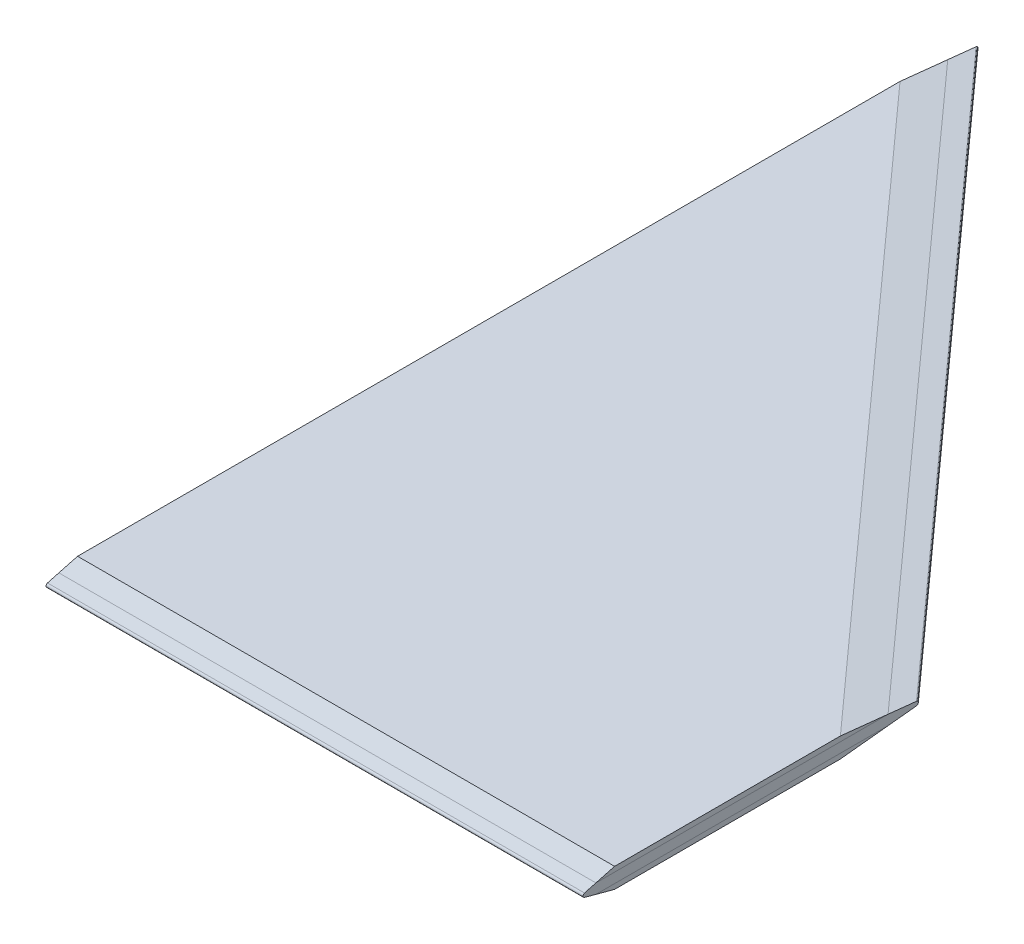
ISO-10303-21;
HEADER;
FILE_DESCRIPTION(('STEP AP214'),'2;1');
FILE_NAME('part.step','',(''),(''),'','','');
FILE_SCHEMA(('AUTOMOTIVE_DESIGN { 1 0 10303 214 1 1 1 1 }'));
ENDSEC;
DATA;
#1=APPLICATION_CONTEXT('core data for automotive mechanical design processes');
#2=APPLICATION_PROTOCOL_DEFINITION('international standard','automotive_design',2000,#1);
#3=PRODUCT_CONTEXT('',#1,'mechanical');
#4=PRODUCT('Part','Part','',(#3));
#5=PRODUCT_RELATED_PRODUCT_CATEGORY('part','',(#4));
#6=PRODUCT_DEFINITION_FORMATION('','',#4);
#7=PRODUCT_DEFINITION_CONTEXT('part definition',#1,'design');
#8=PRODUCT_DEFINITION('design','',#6,#7);
#9=PRODUCT_DEFINITION_SHAPE('','',#8);
#10=(LENGTH_UNIT() NAMED_UNIT(*) SI_UNIT(.MILLI.,.METRE.));
#11=(NAMED_UNIT(*) PLANE_ANGLE_UNIT() SI_UNIT($,.RADIAN.));
#12=(NAMED_UNIT(*) SI_UNIT($,.STERADIAN.) SOLID_ANGLE_UNIT());
#13=UNCERTAINTY_MEASURE_WITH_UNIT(LENGTH_MEASURE(1.E-05),#10,'distance_accuracy_value','');
#14=(GEOMETRIC_REPRESENTATION_CONTEXT(3) GLOBAL_UNCERTAINTY_ASSIGNED_CONTEXT((#13)) GLOBAL_UNIT_ASSIGNED_CONTEXT((#10,
#11,#12)) REPRESENTATION_CONTEXT('',''));
#15=CARTESIAN_POINT('',(0.,0.,0.));
#16=DIRECTION('',(0.,0.,1.));
#17=DIRECTION('',(1.,0.,0.));
#18=AXIS2_PLACEMENT_3D('',#15,#16,#17);
#19=CARTESIAN_POINT('',(0.,-1.6002,-304.8));
#20=DIRECTION('',(1.,0.,0.));
#21=DIRECTION('',(0.,0.,-1.));
#22=AXIS2_PLACEMENT_3D('',#19,#20,#21);
#23=PLANE('',#22);
#24=DIRECTION('',(0.,-0.258819045102523,-0.965925826289068));
#25=VECTOR('',#24,1.);
#26=CARTESIAN_POINT('',(0.,-74.8260354101788,-285.179196536748));
#27=LINE('',#26,#25);
#28=CARTESIAN_POINT('',(0.,0.,-5.92463065701556));
#29=VERTEX_POINT('',#28);
#30=CARTESIAN_POINT('',(-6.E-06,-1.6002,-11.8966583592872));
#31=VERTEX_POINT('',#30);
#32=EDGE_CURVE('E92',#29,#31,#27,.T.);
#33=ORIENTED_EDGE('',*,*,#32,.F.);
#34=DIRECTION('',(0.,0.,1.));
#35=VECTOR('',#34,1.);
#36=CARTESIAN_POINT('',(0.,0.,-304.8));
#37=LINE('',#36,#35);
#38=CARTESIAN_POINT('',(0.,0.,-289.695946428921));
#39=VERTEX_POINT('',#38);
#40=EDGE_CURVE('E111',#39,#29,#37,.T.);
#41=ORIENTED_EDGE('',*,*,#40,.F.);
#42=DIRECTION('',(0.,-0.104528463267647,0.994521895368274));
#43=VECTOR('',#42,1.);
#44=CARTESIAN_POINT('',(0.,1.55267055342959,-304.46861995159));
#45=LINE('',#44,#43);
#46=CARTESIAN_POINT('',(0.,-1.6002,-274.471060429273));
#47=VERTEX_POINT('',#46);
#48=EDGE_CURVE('E75',#39,#47,#45,.T.);
#49=ORIENTED_EDGE('',*,*,#48,.T.);
#50=DIRECTION('',(0.,0.,1.));
#51=VECTOR('',#50,1.);
#52=CARTESIAN_POINT('',(0.,-1.6002,-304.8));
#53=LINE('',#52,#51);
#54=EDGE_CURVE('E55',#47,#31,#53,.T.);
#55=ORIENTED_EDGE('',*,*,#54,.T.);
#56=EDGE_LOOP('',(#33,#41,#49,#55));
#57=FACE_BOUND('',#56,.T.);
#58=ADVANCED_FACE('F52',(#57),#23,.F.);
#59=CARTESIAN_POINT('',(171.45,-1.6002,0.));
#60=DIRECTION('',(-1.,0.,0.));
#61=DIRECTION('',(0.,0.,1.));
#62=AXIS2_PLACEMENT_3D('',#59,#60,#61);
#63=PLANE('',#62);
#64=DIRECTION('',(0.,0.258819045102523,0.965925826289068));
#65=VECTOR('',#64,1.);
#66=CARTESIAN_POINT('',(171.45,1.4811576642539,-0.396875000000005));
#67=LINE('',#66,#65);
#68=CARTESIAN_POINT('',(171.45,-1.6002,-11.8966583592872));
#69=VERTEX_POINT('',#68);
#70=CARTESIAN_POINT('',(171.45,0.,-5.92463065701556));
#71=VERTEX_POINT('',#70);
#72=EDGE_CURVE('E67',#69,#71,#67,.T.);
#73=ORIENTED_EDGE('',*,*,#72,.F.);
#74=DIRECTION('',(0.,0.,-1.));
#75=VECTOR('',#74,1.);
#76=CARTESIAN_POINT('',(171.45,-1.6002,0.));
#77=LINE('',#76,#75);
#78=CARTESIAN_POINT('',(171.45,-1.6002,-83.9710604292726));
#79=VERTEX_POINT('',#78);
#80=EDGE_CURVE('E107',#69,#79,#77,.T.);
#81=ORIENTED_EDGE('',*,*,#80,.T.);
#82=DIRECTION('',(0.,0.104528463267647,-0.994521895368274));
#83=VECTOR('',#82,1.);
#84=CARTESIAN_POINT('',(171.45,-10.3294825768046,-0.917484569652984));
#85=LINE('',#84,#83);
#86=CARTESIAN_POINT('',(171.45,0.,-99.1959464289206));
#87=VERTEX_POINT('',#86);
#88=EDGE_CURVE('E121',#79,#87,#85,.T.);
#89=ORIENTED_EDGE('',*,*,#88,.T.);
#90=DIRECTION('',(0.,0.,-1.));
#91=VECTOR('',#90,1.);
#92=CARTESIAN_POINT('',(171.45,0.,0.));
#93=LINE('',#92,#91);
#94=EDGE_CURVE('E109',#71,#87,#93,.T.);
#95=ORIENTED_EDGE('',*,*,#94,.F.);
#96=EDGE_LOOP('',(#73,#81,#89,#95));
#97=FACE_BOUND('',#96,.T.);
#98=ADVANCED_FACE('F123',(#97),#63,.F.);
#99=CARTESIAN_POINT('',(0.,-1.6002,0.));
#100=DIRECTION('',(0.,-1.,0.));
#101=DIRECTION('',(0.,0.,1.));
#102=AXIS2_PLACEMENT_3D('',#99,#100,#101);
#103=PLANE('',#102);
#104=ORIENTED_EDGE('',*,*,#80,.F.);
#105=DIRECTION('',(-1.,0.,0.));
#106=VECTOR('',#105,1.);
#107=CARTESIAN_POINT('',(171.45,-1.6002,-11.8966583592872));
#108=LINE('',#107,#106);
#109=EDGE_CURVE('E95',#69,#31,#108,.T.);
#110=ORIENTED_EDGE('',*,*,#109,.T.);
#111=ORIENTED_EDGE('',*,*,#54,.F.);
#112=DIRECTION('',(-0.66896473162245,0.,-0.743294146247166));
#113=VECTOR('',#112,1.);
#114=CARTESIAN_POINT('',(213.203565959307,-1.6002,-37.5782093633761));
#115=LINE('',#114,#113);
#116=EDGE_CURVE('E100',#79,#47,#115,.T.);
#117=ORIENTED_EDGE('',*,*,#116,.F.);
#118=EDGE_LOOP('',(#104,#110,#111,#117));
#119=FACE_BOUND('',#118,.T.);
#120=ADVANCED_FACE('F105',(#119),#103,.T.);
#121=CARTESIAN_POINT('',(0.,0.,0.));
#122=DIRECTION('',(0.,-1.,0.));
#123=DIRECTION('',(0.,0.,1.));
#124=AXIS2_PLACEMENT_3D('',#121,#122,#123);
#125=PLANE('',#124);
#126=DIRECTION('',(-1.,0.,0.));
#127=VECTOR('',#126,1.);
#128=CARTESIAN_POINT('',(0.,0.,-5.92463065701556));
#129=LINE('',#128,#127);
#130=EDGE_CURVE('E12',#71,#29,#129,.T.);
#131=ORIENTED_EDGE('',*,*,#130,.F.);
#132=ORIENTED_EDGE('',*,*,#94,.T.);
#133=DIRECTION('',(-0.66896473162245,0.,-0.743294146247166));
#134=VECTOR('',#133,1.);
#135=CARTESIAN_POINT('',(144.047708169077,0.,-129.642937352169));
#136=LINE('',#135,#134);
#137=EDGE_CURVE('E61',#87,#39,#136,.T.);
#138=ORIENTED_EDGE('',*,*,#137,.T.);
#139=ORIENTED_EDGE('',*,*,#40,.T.);
#140=EDGE_LOOP('',(#131,#132,#138,#139));
#141=FACE_BOUND('',#140,.T.);
#142=ADVANCED_FACE('F117',(#141),#125,.F.);
#143=CARTESIAN_POINT('',(213.203565959307,-30.1155870225421,233.727575322316));
#144=DIRECTION('',(-0.115367241229676,0.987881381223681,0.103830517106709));
#145=DIRECTION('',(-0.993249892050592,-0.115994189257429,0.));
#146=AXIS2_PLACEMENT_3D('',#143,#144,#145);
#147=PLANE('',#146);
#148=ORIENTED_EDGE('',*,*,#137,.F.);
#149=ORIENTED_EDGE('',*,*,#88,.F.);
#150=ORIENTED_EDGE('',*,*,#116,.T.);
#151=ORIENTED_EDGE('',*,*,#48,.F.);
#152=EDGE_LOOP('',(#148,#149,#150,#151));
#153=FACE_BOUND('',#152,.T.);
#154=ADVANCED_FACE('F120',(#153),#147,.F.);
#155=CARTESIAN_POINT('',(171.45,1.4811576642539,-0.396875000000005));
#156=DIRECTION('',(0.,-0.965925826289068,0.258819045102523));
#157=DIRECTION('',(0.,-0.258819045102523,-0.965925826289068));
#158=AXIS2_PLACEMENT_3D('',#155,#156,#157);
#159=PLANE('',#158);
#160=ORIENTED_EDGE('',*,*,#32,.T.);
#161=ORIENTED_EDGE('',*,*,#109,.F.);
#162=ORIENTED_EDGE('',*,*,#72,.T.);
#163=ORIENTED_EDGE('',*,*,#130,.T.);
#164=EDGE_LOOP('',(#160,#161,#162,#163));
#165=FACE_BOUND('',#164,.T.);
#166=ADVANCED_FACE('F94',(#165),#159,.T.);
#167=CLOSED_SHELL('',(#58,#98,#120,#142,#154,#166));
#168=MANIFOLD_SOLID_BREP('B2',#167);
#169=CARTESIAN_POINT('',(0.,4.7752,-304.8));
#170=DIRECTION('',(1.,0.,0.));
#171=DIRECTION('',(0.,0.,-1.));
#172=AXIS2_PLACEMENT_3D('',#169,#170,#171);
#173=PLANE('',#172);
#174=DIRECTION('',(0.,-0.258819045102523,0.965925826289068));
#175=VECTOR('',#174,1.);
#176=CARTESIAN_POINT('',(0.,78.0010354101787,-285.179196536748));
#177=LINE('',#176,#175);
#178=CARTESIAN_POINT('',(-6.E-06,4.7752,-11.8966583592872));
#179=VERTEX_POINT('',#178);
#180=CARTESIAN_POINT('',(0.,3.175,-5.92463065701565));
#181=VERTEX_POINT('',#180);
#182=EDGE_CURVE('E240',#179,#181,#177,.T.);
#183=ORIENTED_EDGE('',*,*,#182,.F.);
#184=DIRECTION('',(0.,0.,1.));
#185=VECTOR('',#184,1.);
#186=CARTESIAN_POINT('',(0.,4.7752,-304.8));
#187=LINE('',#186,#185);
#188=CARTESIAN_POINT('',(0.,4.7752,-274.471060429273));
#189=VERTEX_POINT('',#188);
#190=EDGE_CURVE('E228',#189,#179,#187,.T.);
#191=ORIENTED_EDGE('',*,*,#190,.F.);
#192=DIRECTION('',(0.,-0.104528463267647,-0.994521895368274));
#193=VECTOR('',#192,1.);
#194=CARTESIAN_POINT('',(0.,1.6223294465704,-304.46861995159));
#195=LINE('',#194,#193);
#196=CARTESIAN_POINT('',(0.,3.175,-289.695946428921));
#197=VERTEX_POINT('',#196);
#198=EDGE_CURVE('E287',#189,#197,#195,.T.);
#199=ORIENTED_EDGE('',*,*,#198,.T.);
#200=DIRECTION('',(0.,0.,1.));
#201=VECTOR('',#200,1.);
#202=CARTESIAN_POINT('',(0.,3.175,-304.8));
#203=LINE('',#202,#201);
#204=EDGE_CURVE('E278',#197,#181,#203,.T.);
#205=ORIENTED_EDGE('',*,*,#204,.T.);
#206=EDGE_LOOP('',(#183,#191,#199,#205));
#207=FACE_BOUND('',#206,.T.);
#208=ADVANCED_FACE('F225',(#207),#173,.F.);
#209=CARTESIAN_POINT('',(171.45,4.7752,0.));
#210=DIRECTION('',(-1.,0.,0.));
#211=DIRECTION('',(0.,0.,1.));
#212=AXIS2_PLACEMENT_3D('',#209,#210,#211);
#213=PLANE('',#212);
#214=DIRECTION('',(0.,0.258819045102523,-0.965925826289068));
#215=VECTOR('',#214,1.);
#216=CARTESIAN_POINT('',(171.45,1.48115766425389,0.396875000000002));
#217=LINE('',#216,#215);
#218=CARTESIAN_POINT('',(171.45,3.175,-5.92463065701556));
#219=VERTEX_POINT('',#218);
#220=CARTESIAN_POINT('',(171.45,4.7752,-11.8966583592872));
#221=VERTEX_POINT('',#220);
#222=EDGE_CURVE('E268',#219,#221,#217,.T.);
#223=ORIENTED_EDGE('',*,*,#222,.F.);
#224=DIRECTION('',(0.,0.,-1.));
#225=VECTOR('',#224,1.);
#226=CARTESIAN_POINT('',(171.45,3.175,0.));
#227=LINE('',#226,#225);
#228=CARTESIAN_POINT('',(171.45,3.175,-99.1959464289206));
#229=VERTEX_POINT('',#228);
#230=EDGE_CURVE('E248',#219,#229,#227,.T.);
#231=ORIENTED_EDGE('',*,*,#230,.T.);
#232=DIRECTION('',(0.,0.104528463267647,0.994521895368274));
#233=VECTOR('',#232,1.);
#234=CARTESIAN_POINT('',(171.45,13.5044825768046,-0.917484569652984));
#235=LINE('',#234,#233);
#236=CARTESIAN_POINT('',(171.45,4.7752,-83.9710604292726));
#237=VERTEX_POINT('',#236);
#238=EDGE_CURVE('E295',#229,#237,#235,.T.);
#239=ORIENTED_EDGE('',*,*,#238,.T.);
#240=DIRECTION('',(0.,0.,-1.));
#241=VECTOR('',#240,1.);
#242=CARTESIAN_POINT('',(171.45,4.7752,0.));
#243=LINE('',#242,#241);
#244=EDGE_CURVE('E284',#221,#237,#243,.T.);
#245=ORIENTED_EDGE('',*,*,#244,.F.);
#246=EDGE_LOOP('',(#223,#231,#239,#245));
#247=FACE_BOUND('',#246,.T.);
#248=ADVANCED_FACE('F305',(#247),#213,.F.);
#249=CARTESIAN_POINT('',(0.,4.7752,0.));
#250=DIRECTION('',(0.,1.,0.));
#251=DIRECTION('',(0.,0.,1.));
#252=AXIS2_PLACEMENT_3D('',#249,#250,#251);
#253=PLANE('',#252);
#254=ORIENTED_EDGE('',*,*,#190,.T.);
#255=DIRECTION('',(-1.,0.,0.));
#256=VECTOR('',#255,1.);
#257=CARTESIAN_POINT('',(171.45,4.7752,-11.8966583592872));
#258=LINE('',#257,#256);
#259=EDGE_CURVE('E266',#221,#179,#258,.T.);
#260=ORIENTED_EDGE('',*,*,#259,.F.);
#261=ORIENTED_EDGE('',*,*,#244,.T.);
#262=DIRECTION('',(-0.66896473162245,0.,-0.743294146247166));
#263=VECTOR('',#262,1.);
#264=CARTESIAN_POINT('',(213.203565959307,4.7752,-37.5782093633761));
#265=LINE('',#264,#263);
#266=EDGE_CURVE('E279',#237,#189,#265,.T.);
#267=ORIENTED_EDGE('',*,*,#266,.T.);
#268=EDGE_LOOP('',(#254,#260,#261,#267));
#269=FACE_BOUND('',#268,.T.);
#270=ADVANCED_FACE('F282',(#269),#253,.T.);
#271=CARTESIAN_POINT('',(0.,3.175,0.));
#272=DIRECTION('',(0.,1.,0.));
#273=DIRECTION('',(0.,0.,1.));
#274=AXIS2_PLACEMENT_3D('',#271,#272,#273);
#275=PLANE('',#274);
#276=DIRECTION('',(1.,0.,0.));
#277=VECTOR('',#276,1.);
#278=CARTESIAN_POINT('',(0.,3.175,-5.92463065701556));
#279=LINE('',#278,#277);
#280=EDGE_CURVE('E50',#181,#219,#279,.T.);
#281=ORIENTED_EDGE('',*,*,#280,.F.);
#282=ORIENTED_EDGE('',*,*,#204,.F.);
#283=DIRECTION('',(0.66896473162245,0.,0.743294146247166));
#284=VECTOR('',#283,1.);
#285=CARTESIAN_POINT('',(144.047708169077,3.175,-129.642937352169));
#286=LINE('',#285,#284);
#287=EDGE_CURVE('E234',#197,#229,#286,.T.);
#288=ORIENTED_EDGE('',*,*,#287,.T.);
#289=ORIENTED_EDGE('',*,*,#230,.F.);
#290=EDGE_LOOP('',(#281,#282,#288,#289));
#291=FACE_BOUND('',#290,.T.);
#292=ADVANCED_FACE('F292',(#291),#275,.F.);
#293=CARTESIAN_POINT('',(213.203565959307,33.255896338707,233.397515513142));
#294=DIRECTION('',(-0.115367241229676,-0.987881381223681,0.103830517106709));
#295=DIRECTION('',(0.993249892050592,-0.115994189257429,0.));
#296=AXIS2_PLACEMENT_3D('',#293,#294,#295);
#297=PLANE('',#296);
#298=ORIENTED_EDGE('',*,*,#266,.F.);
#299=ORIENTED_EDGE('',*,*,#238,.F.);
#300=ORIENTED_EDGE('',*,*,#287,.F.);
#301=ORIENTED_EDGE('',*,*,#198,.F.);
#302=EDGE_LOOP('',(#298,#299,#300,#301));
#303=FACE_BOUND('',#302,.T.);
#304=ADVANCED_FACE('F294',(#303),#297,.F.);
#305=CARTESIAN_POINT('',(171.45,1.48115766425389,0.396875000000002));
#306=DIRECTION('',(0.,0.965925826289068,0.258819045102523));
#307=DIRECTION('',(0.,-0.258819045102523,0.965925826289068));
#308=AXIS2_PLACEMENT_3D('',#305,#306,#307);
#309=PLANE('',#308);
#310=ORIENTED_EDGE('',*,*,#182,.T.);
#311=ORIENTED_EDGE('',*,*,#280,.T.);
#312=ORIENTED_EDGE('',*,*,#222,.T.);
#313=ORIENTED_EDGE('',*,*,#259,.T.);
#314=EDGE_LOOP('',(#310,#311,#312,#313));
#315=FACE_BOUND('',#314,.T.);
#316=ADVANCED_FACE('F267',(#315),#309,.T.);
#317=CLOSED_SHELL('',(#208,#248,#270,#292,#304,#316));
#318=MANIFOLD_SOLID_BREP('B6',#317);
#319=CARTESIAN_POINT('',(0.,3.175,0.));
#320=DIRECTION('',(0.,-1.,0.));
#321=DIRECTION('',(0.,0.,-1.));
#322=AXIS2_PLACEMENT_3D('',#319,#320,#321);
#323=PLANE('',#322);
#324=DIRECTION('',(-1.,0.,0.));
#325=VECTOR('',#324,1.);
#326=CARTESIAN_POINT('',(0.,3.175,-5.92463065701556));
#327=LINE('',#326,#325);
#328=CARTESIAN_POINT('',(171.45,3.175,-5.92463065701556));
#329=VERTEX_POINT('',#328);
#330=CARTESIAN_POINT('',(0.,3.175,-5.92463065701556));
#331=VERTEX_POINT('',#330);
#332=EDGE_CURVE('E377',#329,#331,#327,.T.);
#333=ORIENTED_EDGE('',*,*,#332,.F.);
#334=DIRECTION('',(0.,0.,-1.));
#335=VECTOR('',#334,1.);
#336=CARTESIAN_POINT('',(171.45,3.175,-114.3));
#337=LINE('',#336,#335);
#338=CARTESIAN_POINT('',(171.45,3.175,-99.1959464289206));
#339=VERTEX_POINT('',#338);
#340=EDGE_CURVE('E451',#329,#339,#337,.T.);
#341=ORIENTED_EDGE('',*,*,#340,.T.);
#342=DIRECTION('',(-0.66896473162245,0.,-0.743294146247166));
#343=VECTOR('',#342,1.);
#344=CARTESIAN_POINT('',(144.047708169077,3.175,-129.642937352169));
#345=LINE('',#344,#343);
#346=CARTESIAN_POINT('',(0.,3.175,-289.695946428921));
#347=VERTEX_POINT('',#346);
#348=EDGE_CURVE('E436',#339,#347,#345,.T.);
#349=ORIENTED_EDGE('',*,*,#348,.T.);
#350=DIRECTION('',(0.,0.,1.));
#351=VECTOR('',#350,1.);
#352=CARTESIAN_POINT('',(0.,3.175,0.));
#353=LINE('',#352,#351);
#354=EDGE_CURVE('E449',#347,#331,#353,.T.);
#355=ORIENTED_EDGE('',*,*,#354,.T.);
#356=EDGE_LOOP('',(#333,#341,#349,#355));
#357=FACE_BOUND('',#356,.T.);
#358=ADVANCED_FACE('F367',(#357),#323,.F.);
#359=CARTESIAN_POINT('',(0.,0.,0.));
#360=DIRECTION('',(0.,-1.,0.));
#361=DIRECTION('',(0.,0.,-1.));
#362=AXIS2_PLACEMENT_3D('',#359,#360,#361);
#363=PLANE('',#362);
#364=DIRECTION('',(0.,0.,-1.));
#365=VECTOR('',#364,1.);
#366=CARTESIAN_POINT('',(171.45,0.,-114.3));
#367=LINE('',#366,#365);
#368=CARTESIAN_POINT('',(171.45,0.,-5.92463065701556));
#369=VERTEX_POINT('',#368);
#370=CARTESIAN_POINT('',(171.45,0.,-99.1959464289207));
#371=VERTEX_POINT('',#370);
#372=EDGE_CURVE('E464',#369,#371,#367,.T.);
#373=ORIENTED_EDGE('',*,*,#372,.F.);
#374=DIRECTION('',(-1.,0.,0.));
#375=VECTOR('',#374,1.);
#376=CARTESIAN_POINT('',(0.,0.,-5.92463065701556));
#377=LINE('',#376,#375);
#378=CARTESIAN_POINT('',(0.,0.,-5.92463065701556));
#379=VERTEX_POINT('',#378);
#380=EDGE_CURVE('E402',#369,#379,#377,.T.);
#381=ORIENTED_EDGE('',*,*,#380,.T.);
#382=DIRECTION('',(0.,0.,1.));
#383=VECTOR('',#382,1.);
#384=CARTESIAN_POINT('',(0.,0.,0.));
#385=LINE('',#384,#383);
#386=CARTESIAN_POINT('',(0.,0.,-289.695946428921));
#387=VERTEX_POINT('',#386);
#388=EDGE_CURVE('E460',#387,#379,#385,.T.);
#389=ORIENTED_EDGE('',*,*,#388,.F.);
#390=DIRECTION('',(-0.66896473162245,0.,-0.743294146247166));
#391=VECTOR('',#390,1.);
#392=CARTESIAN_POINT('',(144.047708169077,0.,-129.642937352169));
#393=LINE('',#392,#391);
#394=EDGE_CURVE('E453',#371,#387,#393,.T.);
#395=ORIENTED_EDGE('',*,*,#394,.F.);
#396=EDGE_LOOP('',(#373,#381,#389,#395));
#397=FACE_BOUND('',#396,.T.);
#398=ADVANCED_FACE('F517',(#397),#363,.T.);
#399=CARTESIAN_POINT('',(171.45,3.175,-114.3));
#400=DIRECTION('',(-1.,0.,0.));
#401=DIRECTION('',(0.,0.,1.));
#402=AXIS2_PLACEMENT_3D('',#399,#400,#401);
#403=PLANE('',#402);
#404=DIRECTION('',(0.,0.258819045102523,-0.965925826289068));
#405=VECTOR('',#404,1.);
#406=CARTESIAN_POINT('',(171.45,1.48115766425389,0.396875000000002));
#407=LINE('',#406,#405);
#408=CARTESIAN_POINT('',(171.45,2.20086289969356,-2.28910150513413));
#409=VERTEX_POINT('',#408);
#410=EDGE_CURVE('E524',#409,#329,#407,.T.);
#411=ORIENTED_EDGE('',*,*,#410,.F.);
#412=CARTESIAN_POINT('',(171.45,1.5875,-2.45345159877422));
#413=DIRECTION('',(-1.,0.,0.));
#414=DIRECTION('',(0.,0.,1.));
#415=AXIS2_PLACEMENT_3D('',#412,#413,#414);
#416=CIRCLE('',#415,0.634999999999998);
#417=CARTESIAN_POINT('',(171.45,0.974137100306442,-2.28910150513413));
#418=VERTEX_POINT('',#417);
#419=EDGE_CURVE('E527',#409,#418,#416,.F.);
#420=ORIENTED_EDGE('',*,*,#419,.T.);
#421=DIRECTION('',(0.,0.258819045102523,0.965925826289068));
#422=VECTOR('',#421,1.);
#423=CARTESIAN_POINT('',(171.45,1.4811576642539,-0.396875000000005));
#424=LINE('',#423,#422);
#425=EDGE_CURVE('E515',#369,#418,#424,.T.);
#426=ORIENTED_EDGE('',*,*,#425,.F.);
#427=ORIENTED_EDGE('',*,*,#372,.T.);
#428=DIRECTION('',(0.,0.104528463267647,-0.994521895368274));
#429=VECTOR('',#428,1.);
#430=CARTESIAN_POINT('',(171.45,1.60484534191753,-114.465029904587));
#431=LINE('',#430,#429);
#432=CARTESIAN_POINT('',(171.45,0.955978596441135,-108.291475205898));
#433=VERTEX_POINT('',#432);
#434=EDGE_CURVE('E444',#371,#433,#431,.T.);
#435=ORIENTED_EDGE('',*,*,#434,.T.);
#436=CARTESIAN_POINT('',(171.45,2.21902140355886,-108.291475205898));
#437=CARTESIAN_POINT('',(171.45,2.21537069827115,-108.326483393479));
#438=CARTESIAN_POINT('',(171.45,2.20875507639727,-108.361171583521));
#439=CARTESIAN_POINT('',(171.45,2.18989882655979,-108.428985215183));
#440=CARTESIAN_POINT('',(171.45,2.17765819859617,-108.462110656803));
#441=CARTESIAN_POINT('',(171.45,2.14785676366179,-108.525876038275));
#442=CARTESIAN_POINT('',(171.45,2.13029595669101,-108.556515978127));
#443=CARTESIAN_POINT('',(171.45,2.09034729964685,-108.61446770557));
#444=CARTESIAN_POINT('',(171.45,2.06795944957346,-108.641779493161));
#445=CARTESIAN_POINT('',(171.45,2.01897183970322,-108.692320965917));
#446=CARTESIAN_POINT('',(171.45,1.99237207990637,-108.715550651083));
#447=CARTESIAN_POINT('',(171.45,1.93569493881936,-108.757287387939));
#448=CARTESIAN_POINT('',(171.45,1.90561755752919,-108.775794439629));
#449=CARTESIAN_POINT('',(171.45,1.84281457949768,-108.807575413017));
#450=CARTESIAN_POINT('',(171.45,1.81008898275635,-108.820849334713));
#451=CARTESIAN_POINT('',(171.45,1.7428922354306,-108.841797947701));
#452=CARTESIAN_POINT('',(171.45,1.70842108484619,-108.849472638992));
#453=CARTESIAN_POINT('',(171.45,1.63868397915135,-108.859011110153));
#454=CARTESIAN_POINT('',(171.45,1.60341802404093,-108.860874890023));
#455=CARTESIAN_POINT('',(171.45,1.53306399435914,-108.858740130808));
#456=CARTESIAN_POINT('',(171.45,1.49797591978779,-108.854741591723));
#457=CARTESIAN_POINT('',(171.45,1.42894543126021,-108.840992490159));
#458=CARTESIAN_POINT('',(171.45,1.39500301730399,-108.831241927681));
#459=CARTESIAN_POINT('',(171.45,1.32920001245587,-108.806257673348));
#460=CARTESIAN_POINT('',(171.45,1.29733942156397,-108.791023981493));
#461=CARTESIAN_POINT('',(171.45,1.23657887959298,-108.755493782851));
#462=CARTESIAN_POINT('',(171.45,1.2076789285139,-108.735197276063));
#463=CARTESIAN_POINT('',(171.45,1.15363654797378,-108.690100698385));
#464=CARTESIAN_POINT('',(171.45,1.12849411851274,-108.665300627495));
#465=CARTESIAN_POINT('',(171.45,1.08266105756265,-108.611883010287));
#466=CARTESIAN_POINT('',(171.45,1.06197042607358,-108.583265463968));
#467=CARTESIAN_POINT('',(171.45,1.02560859887085,-108.522994484941));
#468=CARTESIAN_POINT('',(171.45,1.00993740315718,-108.491341052232));
#469=CARTESIAN_POINT('',(171.45,0.986425621786954,-108.431887094175));
#470=CARTESIAN_POINT('',(171.45,0.977676905455375,-108.404441313507));
#471=CARTESIAN_POINT('',(171.45,0.963949920251243,-108.3485625582));
#472=CARTESIAN_POINT('',(171.45,0.958979491678325,-108.320127658134));
#473=CARTESIAN_POINT('',(171.45,0.95597859644116,-108.291475205899));
#474=B_SPLINE_CURVE_WITH_KNOTS('',3,(#436,#437,#438,#439,#440,#441,#442,#443,#444,#445,#446,
#447,#448,#449,#450,#451,#452,#453,#454,#455,#456,#457,#458,#459,#460,#461,#462,#463,#464,#465,
#466,#467,#468,#469,#470,#471,#472,#473),.UNSPECIFIED.,.F.,.F.,(4,2,2,2,2,2,2,2,2,2,2,2,2,2,2,2,
2,2,4),(0.,0.105458490111168,0.210916980222343,0.316375470333506,0.421833960444665,
0.527292450555829,0.632750940666996,0.738209430778161,0.843667920889318,0.949126411000481,
1.05458490111164,1.1600433912228,1.26550188133397,1.37096037144514,1.47641886155629,
1.58187735166746,1.68733584177862,1.77349836197767,1.85983919300777),.UNSPECIFIED.);
#475=CARTESIAN_POINT('',(171.45,2.21902140355886,-108.291475205898));
#476=VERTEX_POINT('',#475);
#477=EDGE_CURVE('E466',#476,#433,#474,.T.);
#478=ORIENTED_EDGE('',*,*,#477,.F.);
#479=DIRECTION('',(0.,0.104528463267647,0.994521895368274));
#480=VECTOR('',#479,1.);
#481=CARTESIAN_POINT('',(171.45,1.60484534191753,-114.134970095413));
#482=LINE('',#481,#480);
#483=EDGE_CURVE('E443',#476,#339,#482,.T.);
#484=ORIENTED_EDGE('',*,*,#483,.T.);
#485=ORIENTED_EDGE('',*,*,#340,.F.);
#486=EDGE_LOOP('',(#411,#420,#426,#427,#435,#478,#484,#485));
#487=FACE_BOUND('',#486,.T.);
#488=ADVANCED_FACE('F369',(#487),#403,.F.);
#489=CARTESIAN_POINT('',(0.,3.175,0.));
#490=DIRECTION('',(1.,0.,0.));
#491=DIRECTION('',(0.,0.,-1.));
#492=AXIS2_PLACEMENT_3D('',#489,#490,#491);
#493=PLANE('',#492);
#494=DIRECTION('',(0.,-0.258819045102523,0.965925826289068));
#495=VECTOR('',#494,1.);
#496=CARTESIAN_POINT('',(0.,1.6938423357461,-0.396875000000004));
#497=LINE('',#496,#495);
#498=CARTESIAN_POINT('',(0.,2.20086289969356,-2.28910150513413));
#499=VERTEX_POINT('',#498);
#500=EDGE_CURVE('E457',#331,#499,#497,.T.);
#501=ORIENTED_EDGE('',*,*,#500,.F.);
#502=ORIENTED_EDGE('',*,*,#354,.F.);
#503=DIRECTION('',(0.,-0.104528463267647,-0.994521895368274));
#504=VECTOR('',#503,1.);
#505=CARTESIAN_POINT('',(0.,33.2905870225421,-3.16527574358101));
#506=LINE('',#505,#504);
#507=CARTESIAN_POINT('',(0.,2.21902140355886,-298.791475205898));
#508=VERTEX_POINT('',#507);
#509=EDGE_CURVE('E433',#347,#508,#506,.T.);
#510=ORIENTED_EDGE('',*,*,#509,.T.);
#511=CARTESIAN_POINT('',(0.,0.955978596441138,-298.791475205898));
#512=CARTESIAN_POINT('',(0.,0.959629301728853,-298.826483393479));
#513=CARTESIAN_POINT('',(0.,0.966244923602725,-298.861171583521));
#514=CARTESIAN_POINT('',(0.,0.98510117344021,-298.928985215183));
#515=CARTESIAN_POINT('',(0.,0.997341801403824,-298.962110656803));
#516=CARTESIAN_POINT('',(0.,1.0271432363382,-299.025876038275));
#517=CARTESIAN_POINT('',(0.,1.04470404330896,-299.056515978127));
#518=CARTESIAN_POINT('',(0.,1.08465270035309,-299.11446770557));
#519=CARTESIAN_POINT('',(0.,1.10704055042646,-299.141779493161));
#520=CARTESIAN_POINT('',(0.,1.15602816029667,-299.192320965917));
#521=CARTESIAN_POINT('',(0.,1.18262792009352,-299.215550651083));
#522=CARTESIAN_POINT('',(0.,1.23930506118053,-299.257287387938));
#523=CARTESIAN_POINT('',(0.,1.26938244247069,-299.275794439629));
#524=CARTESIAN_POINT('',(0.,1.33218542050217,-299.307575413016));
#525=CARTESIAN_POINT('',(0.,1.36491101724349,-299.320849334713));
#526=CARTESIAN_POINT('',(0.,1.43210776456921,-299.341797947701));
#527=CARTESIAN_POINT('',(0.,1.46657891515361,-299.349472638992));
#528=CARTESIAN_POINT('',(0.,1.53631602084842,-299.359011110153));
#529=CARTESIAN_POINT('',(0.,1.57158197595883,-299.360874890023));
#530=CARTESIAN_POINT('',(0.,1.6419360056406,-299.358740130808));
#531=CARTESIAN_POINT('',(0.,1.67702408021195,-299.354741591723));
#532=CARTESIAN_POINT('',(0.,1.74605456873951,-299.340992490159));
#533=CARTESIAN_POINT('',(0.,1.77999698269572,-299.331241927681));
#534=CARTESIAN_POINT('',(0.,1.84579998754383,-299.306257673348));
#535=CARTESIAN_POINT('',(0.,1.87766057843573,-299.291023981493));
#536=CARTESIAN_POINT('',(0.,1.93842112040673,-299.255493782851));
#537=CARTESIAN_POINT('',(0.,1.96732107148582,-299.235197276063));
#538=CARTESIAN_POINT('',(0.,2.02136345202595,-299.190100698386));
#539=CARTESIAN_POINT('',(0.,2.046505881487,-299.165300627495));
#540=CARTESIAN_POINT('',(0.,2.09233894243712,-299.111883010287));
#541=CARTESIAN_POINT('',(0.,2.11302957392619,-299.083265463969));
#542=CARTESIAN_POINT('',(0.,2.14939140112895,-299.022994484941));
#543=CARTESIAN_POINT('',(0.,2.16506259684264,-298.991341052233));
#544=CARTESIAN_POINT('',(0.,2.18857437821293,-298.931887094176));
#545=CARTESIAN_POINT('',(0.,2.19732309454454,-298.904441313508));
#546=CARTESIAN_POINT('',(0.,2.21105007974872,-298.8485625582));
#547=CARTESIAN_POINT('',(0.,2.21602050832166,-298.820127658134));
#548=CARTESIAN_POINT('',(0.,2.21902140355883,-298.791475205899));
#549=B_SPLINE_CURVE_WITH_KNOTS('',3,(#511,#512,#513,#514,#515,#516,#517,#518,#519,#520,#521,
#522,#523,#524,#525,#526,#527,#528,#529,#530,#531,#532,#533,#534,#535,#536,#537,#538,#539,#540,
#541,#542,#543,#544,#545,#546,#547,#548),.UNSPECIFIED.,.F.,.F.,(4,2,2,2,2,2,2,2,2,2,2,2,2,2,2,2,
2,2,4),(0.,0.105458490111113,0.210916980222262,0.316375470333343,0.421833960444497,
0.527292450555623,0.632750940666785,0.738209430777911,0.843667920889044,0.949126411000175,
1.05458490111131,1.16004339122244,1.26550188133357,1.37096037144471,1.47641886155585,
1.58187735166702,1.68733584177813,1.77349836197737,1.85983919300764),.UNSPECIFIED.);
#550=CARTESIAN_POINT('',(0.,0.955978596441139,-298.791475205898));
#551=VERTEX_POINT('',#550);
#552=EDGE_CURVE('E452',#551,#508,#549,.T.);
#553=ORIENTED_EDGE('',*,*,#552,.F.);
#554=DIRECTION('',(0.,-0.104528463267647,0.994521895368274));
#555=VECTOR('',#554,1.);
#556=CARTESIAN_POINT('',(0.,-30.080896338707,-3.49533555275418));
#557=LINE('',#556,#555);
#558=EDGE_CURVE('E495',#551,#387,#557,.T.);
#559=ORIENTED_EDGE('',*,*,#558,.T.);
#560=ORIENTED_EDGE('',*,*,#388,.T.);
#561=DIRECTION('',(0.,-0.258819045102523,-0.965925826289068));
#562=VECTOR('',#561,1.);
#563=CARTESIAN_POINT('',(0.,1.69384233574611,0.396875000000002));
#564=LINE('',#563,#562);
#565=CARTESIAN_POINT('',(0.,0.974137100306443,-2.28910150513413));
#566=VERTEX_POINT('',#565);
#567=EDGE_CURVE('E385',#566,#379,#564,.T.);
#568=ORIENTED_EDGE('',*,*,#567,.F.);
#569=CARTESIAN_POINT('',(0.,1.5875,-2.45345159877422));
#570=DIRECTION('',(-1.,0.,0.));
#571=DIRECTION('',(0.,0.,1.));
#572=AXIS2_PLACEMENT_3D('',#569,#570,#571);
#573=CIRCLE('',#572,0.634999999999998);
#574=EDGE_CURVE('E223',#566,#499,#573,.T.);
#575=ORIENTED_EDGE('',*,*,#574,.T.);
#576=EDGE_LOOP('',(#501,#502,#510,#553,#559,#560,#568,#575));
#577=FACE_BOUND('',#576,.T.);
#578=ADVANCED_FACE('F456',(#577),#493,.F.);
#579=CARTESIAN_POINT('',(213.203565959307,1.5875,-61.832248565827));
#580=DIRECTION('',(-1.,0.,0.));
#581=DIRECTION('',(0.,0.,1.));
#582=AXIS2_PLACEMENT_3D('',#579,#580,#581);
#583=CIRCLE('',#582,0.634999999999992);
#584=DIRECTION('',(-0.66896473162245,0.,-0.743294146247166));
#585=VECTOR('',#584,1.);
#586=SURFACE_OF_LINEAR_EXTRUSION('',#583,#585);
#587=ORIENTED_EDGE('',*,*,#477,.T.);
#588=DIRECTION('',(-0.66896473162245,0.,-0.743294146247166));
#589=VECTOR('',#588,1.);
#590=CARTESIAN_POINT('',(213.203565959307,0.955978596441139,-61.8986241400018));
#591=LINE('',#590,#589);
#592=EDGE_CURVE('E492',#433,#551,#591,.T.);
#593=ORIENTED_EDGE('',*,*,#592,.T.);
#594=ORIENTED_EDGE('',*,*,#552,.T.);
#595=DIRECTION('',(-0.66896473162245,0.,-0.743294146247166));
#596=VECTOR('',#595,1.);
#597=CARTESIAN_POINT('',(213.203565959307,2.21902140355886,-61.8986241400018));
#598=LINE('',#597,#596);
#599=EDGE_CURVE('E439',#476,#508,#598,.T.);
#600=ORIENTED_EDGE('',*,*,#599,.F.);
#601=EDGE_LOOP('',(#587,#593,#594,#600));
#602=FACE_BOUND('',#601,.T.);
#603=ADVANCED_FACE('F478',(#602),#586,.T.);
#604=CARTESIAN_POINT('',(213.203565959307,33.255896338707,233.397515513142));
#605=DIRECTION('',(-0.115367241229676,-0.987881381223681,0.103830517106709));
#606=DIRECTION('',(0.993249892050592,-0.115994189257429,0.));
#607=AXIS2_PLACEMENT_3D('',#604,#605,#606);
#608=PLANE('',#607);
#609=ORIENTED_EDGE('',*,*,#599,.T.);
#610=ORIENTED_EDGE('',*,*,#509,.F.);
#611=ORIENTED_EDGE('',*,*,#348,.F.);
#612=ORIENTED_EDGE('',*,*,#483,.F.);
#613=EDGE_LOOP('',(#609,#610,#611,#612));
#614=FACE_BOUND('',#613,.T.);
#615=ADVANCED_FACE('F435',(#614),#608,.F.);
#616=CARTESIAN_POINT('',(213.203565959307,-30.1155870225421,233.727575322316));
#617=DIRECTION('',(-0.115367241229676,0.987881381223681,0.103830517106709));
#618=DIRECTION('',(-0.993249892050592,-0.115994189257429,0.));
#619=AXIS2_PLACEMENT_3D('',#616,#617,#618);
#620=PLANE('',#619);
#621=ORIENTED_EDGE('',*,*,#394,.T.);
#622=ORIENTED_EDGE('',*,*,#558,.F.);
#623=ORIENTED_EDGE('',*,*,#592,.F.);
#624=ORIENTED_EDGE('',*,*,#434,.F.);
#625=EDGE_LOOP('',(#621,#622,#623,#624));
#626=FACE_BOUND('',#625,.T.);
#627=ADVANCED_FACE('F510',(#626),#620,.F.);
#628=CARTESIAN_POINT('',(171.45,1.5875,-2.45345159877422));
#629=DIRECTION('',(-1.,0.,0.));
#630=DIRECTION('',(0.,0.,1.));
#631=AXIS2_PLACEMENT_3D('',#628,#629,#630);
#632=CYLINDRICAL_SURFACE('',#631,0.634999999999998);
#633=DIRECTION('',(-1.,0.,0.));
#634=VECTOR('',#633,1.);
#635=CARTESIAN_POINT('',(171.45,0.974137100306442,-2.28910150513413));
#636=LINE('',#635,#634);
#637=EDGE_CURVE('E490',#418,#566,#636,.T.);
#638=ORIENTED_EDGE('',*,*,#637,.F.);
#639=ORIENTED_EDGE('',*,*,#419,.F.);
#640=DIRECTION('',(-1.,0.,0.));
#641=VECTOR('',#640,1.);
#642=CARTESIAN_POINT('',(171.45,2.20086289969356,-2.28910150513413));
#643=LINE('',#642,#641);
#644=EDGE_CURVE('E520',#409,#499,#643,.T.);
#645=ORIENTED_EDGE('',*,*,#644,.T.);
#646=ORIENTED_EDGE('',*,*,#574,.F.);
#647=EDGE_LOOP('',(#638,#639,#645,#646));
#648=FACE_BOUND('',#647,.T.);
#649=ADVANCED_FACE('F532',(#648),#632,.T.);
#650=CARTESIAN_POINT('',(171.45,1.48115766425389,0.396875000000002));
#651=DIRECTION('',(0.,0.965925826289068,0.258819045102523));
#652=DIRECTION('',(0.,-0.258819045102523,0.965925826289068));
#653=AXIS2_PLACEMENT_3D('',#650,#651,#652);
#654=PLANE('',#653);
#655=ORIENTED_EDGE('',*,*,#500,.T.);
#656=ORIENTED_EDGE('',*,*,#644,.F.);
#657=ORIENTED_EDGE('',*,*,#410,.T.);
#658=ORIENTED_EDGE('',*,*,#332,.T.);
#659=EDGE_LOOP('',(#655,#656,#657,#658));
#660=FACE_BOUND('',#659,.T.);
#661=ADVANCED_FACE('F522',(#660),#654,.T.);
#662=CARTESIAN_POINT('',(171.45,1.4811576642539,-0.396875000000005));
#663=DIRECTION('',(0.,-0.965925826289068,0.258819045102523));
#664=DIRECTION('',(0.,-0.258819045102523,-0.965925826289068));
#665=AXIS2_PLACEMENT_3D('',#662,#663,#664);
#666=PLANE('',#665);
#667=ORIENTED_EDGE('',*,*,#567,.T.);
#668=ORIENTED_EDGE('',*,*,#380,.F.);
#669=ORIENTED_EDGE('',*,*,#425,.T.);
#670=ORIENTED_EDGE('',*,*,#637,.T.);
#671=EDGE_LOOP('',(#667,#668,#669,#670));
#672=FACE_BOUND('',#671,.T.);
#673=ADVANCED_FACE('F533',(#672),#666,.T.);
#674=CLOSED_SHELL('',(#358,#398,#488,#578,#603,#615,#627,#649,#661,#673));
#675=MANIFOLD_SOLID_BREP('B44',#674);
#676=ADVANCED_BREP_SHAPE_REPRESENTATION('',(#18,#168,#318,#675),#14);
#677=SHAPE_DEFINITION_REPRESENTATION(#9,#676);
ENDSEC;
END-ISO-10303-21;
